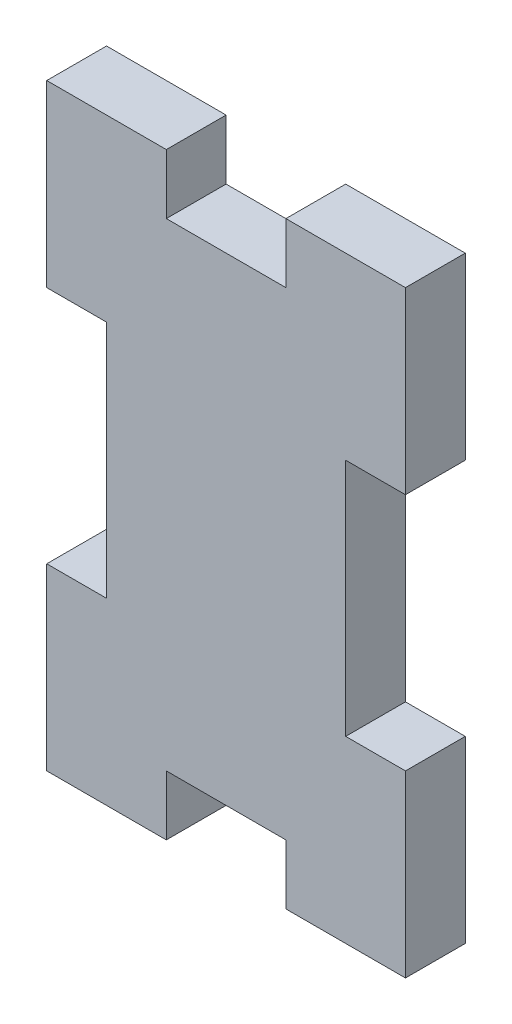
ISO-10303-21;
HEADER;
FILE_DESCRIPTION(('STEP AP214'),'2;1');
FILE_NAME('part.step','',(''),(''),'','','');
FILE_SCHEMA(('AUTOMOTIVE_DESIGN { 1 0 10303 214 1 1 1 1 }'));
ENDSEC;
DATA;
#1=APPLICATION_CONTEXT('core data for automotive mechanical design processes');
#2=APPLICATION_PROTOCOL_DEFINITION('international standard','automotive_design',2000,#1);
#3=PRODUCT_CONTEXT('',#1,'mechanical');
#4=PRODUCT('Part','Part','',(#3));
#5=PRODUCT_RELATED_PRODUCT_CATEGORY('part','',(#4));
#6=PRODUCT_DEFINITION_FORMATION('','',#4);
#7=PRODUCT_DEFINITION_CONTEXT('part definition',#1,'design');
#8=PRODUCT_DEFINITION('design','',#6,#7);
#9=PRODUCT_DEFINITION_SHAPE('','',#8);
#10=(LENGTH_UNIT() NAMED_UNIT(*) SI_UNIT(.MILLI.,.METRE.));
#11=(NAMED_UNIT(*) PLANE_ANGLE_UNIT() SI_UNIT($,.RADIAN.));
#12=(NAMED_UNIT(*) SI_UNIT($,.STERADIAN.) SOLID_ANGLE_UNIT());
#13=UNCERTAINTY_MEASURE_WITH_UNIT(LENGTH_MEASURE(1.E-05),#10,'distance_accuracy_value','');
#14=(GEOMETRIC_REPRESENTATION_CONTEXT(3) GLOBAL_UNCERTAINTY_ASSIGNED_CONTEXT((#13)) GLOBAL_UNIT_ASSIGNED_CONTEXT((#10,
#11,#12)) REPRESENTATION_CONTEXT('',''));
#15=CARTESIAN_POINT('',(0.,0.,0.));
#16=DIRECTION('',(0.,0.,1.));
#17=DIRECTION('',(1.,0.,0.));
#18=AXIS2_PLACEMENT_3D('',#15,#16,#17);
#19=CARTESIAN_POINT('',(12.9990004631941,15.5152745975511,5.));
#20=DIRECTION('',(1.,0.,0.));
#21=DIRECTION('',(0.,0.,-1.));
#22=AXIS2_PLACEMENT_3D('',#19,#20,#21);
#23=PLANE('',#22);
#24=DIRECTION('',(0.,-1.,0.));
#25=VECTOR('',#24,1.);
#26=CARTESIAN_POINT('',(12.9990004631941,15.5152745975511,0.));
#27=LINE('',#26,#25);
#28=CARTESIAN_POINT('',(12.9990004631941,20.5152745975511,0.));
#29=VERTEX_POINT('',#28);
#30=CARTESIAN_POINT('',(12.9990004631941,5.51527459755107,0.));
#31=VERTEX_POINT('',#30);
#32=EDGE_CURVE('E129',#29,#31,#27,.T.);
#33=ORIENTED_EDGE('',*,*,#32,.T.);
#34=DIRECTION('',(0.,0.,-1.));
#35=VECTOR('',#34,1.);
#36=CARTESIAN_POINT('',(12.9990004631941,5.51527459755107,5.));
#37=LINE('',#36,#35);
#38=CARTESIAN_POINT('',(12.9990004631941,5.51527459755107,5.));
#39=VERTEX_POINT('',#38);
#40=EDGE_CURVE('E11',#39,#31,#37,.T.);
#41=ORIENTED_EDGE('',*,*,#40,.F.);
#42=DIRECTION('',(0.,-1.,0.));
#43=VECTOR('',#42,1.);
#44=CARTESIAN_POINT('',(12.9990004631941,20.5152745975511,5.));
#45=LINE('',#44,#43);
#46=CARTESIAN_POINT('',(12.9990004631941,20.5152745975511,5.));
#47=VERTEX_POINT('',#46);
#48=EDGE_CURVE('E135',#47,#39,#45,.T.);
#49=ORIENTED_EDGE('',*,*,#48,.F.);
#50=DIRECTION('',(0.,0.,-1.));
#51=VECTOR('',#50,1.);
#52=CARTESIAN_POINT('',(12.9990004631941,20.5152745975511,5.));
#53=LINE('',#52,#51);
#54=EDGE_CURVE('E205',#47,#29,#53,.T.);
#55=ORIENTED_EDGE('',*,*,#54,.T.);
#56=EDGE_LOOP('',(#33,#41,#49,#55));
#57=FACE_BOUND('',#56,.T.);
#58=ADVANCED_FACE('F41',(#57),#23,.F.);
#59=CARTESIAN_POINT('',(12.9990004631941,5.51527459755107,5.));
#60=DIRECTION('',(0.,1.,0.));
#61=DIRECTION('',(0.,0.,1.));
#62=AXIS2_PLACEMENT_3D('',#59,#60,#61);
#63=PLANE('',#62);
#64=DIRECTION('',(1.,0.,0.));
#65=VECTOR('',#64,1.);
#66=CARTESIAN_POINT('',(12.9990004631941,5.51527459755107,0.));
#67=LINE('',#66,#65);
#68=CARTESIAN_POINT('',(17.9990004631941,5.51527459755107,0.));
#69=VERTEX_POINT('',#68);
#70=EDGE_CURVE('E210',#31,#69,#67,.T.);
#71=ORIENTED_EDGE('',*,*,#70,.T.);
#72=DIRECTION('',(0.,0.,-1.));
#73=VECTOR('',#72,1.);
#74=CARTESIAN_POINT('',(17.9990004631941,5.51527459755107,5.));
#75=LINE('',#74,#73);
#76=CARTESIAN_POINT('',(17.9990004631941,5.51527459755107,5.));
#77=VERTEX_POINT('',#76);
#78=EDGE_CURVE('E49',#77,#69,#75,.T.);
#79=ORIENTED_EDGE('',*,*,#78,.F.);
#80=DIRECTION('',(1.,0.,0.));
#81=VECTOR('',#80,1.);
#82=CARTESIAN_POINT('',(12.9990004631941,5.51527459755107,5.));
#83=LINE('',#82,#81);
#84=EDGE_CURVE('E356',#39,#77,#83,.T.);
#85=ORIENTED_EDGE('',*,*,#84,.F.);
#86=ORIENTED_EDGE('',*,*,#40,.T.);
#87=EDGE_LOOP('',(#71,#79,#85,#86));
#88=FACE_BOUND('',#87,.T.);
#89=ADVANCED_FACE('F359',(#88),#63,.F.);
#90=CARTESIAN_POINT('',(17.9990004631941,-14.4847254024489,5.));
#91=DIRECTION('',(1.,0.,0.));
#92=DIRECTION('',(0.,0.,-1.));
#93=AXIS2_PLACEMENT_3D('',#90,#91,#92);
#94=PLANE('',#93);
#95=DIRECTION('',(0.,-1.,0.));
#96=VECTOR('',#95,1.);
#97=CARTESIAN_POINT('',(17.9990004631941,-14.4847254024489,0.));
#98=LINE('',#97,#96);
#99=CARTESIAN_POINT('',(17.9990004631941,-14.4847254024489,0.));
#100=VERTEX_POINT('',#99);
#101=EDGE_CURVE('E212',#69,#100,#98,.T.);
#102=ORIENTED_EDGE('',*,*,#101,.T.);
#103=DIRECTION('',(0.,0.,-1.));
#104=VECTOR('',#103,1.);
#105=CARTESIAN_POINT('',(17.9990004631941,-14.4847254024489,5.));
#106=LINE('',#105,#104);
#107=CARTESIAN_POINT('',(17.9990004631941,-14.4847254024489,5.));
#108=VERTEX_POINT('',#107);
#109=EDGE_CURVE('E292',#108,#100,#106,.T.);
#110=ORIENTED_EDGE('',*,*,#109,.F.);
#111=DIRECTION('',(0.,-1.,0.));
#112=VECTOR('',#111,1.);
#113=CARTESIAN_POINT('',(17.9990004631941,-14.4847254024489,5.));
#114=LINE('',#113,#112);
#115=EDGE_CURVE('E301',#77,#108,#114,.T.);
#116=ORIENTED_EDGE('',*,*,#115,.F.);
#117=ORIENTED_EDGE('',*,*,#78,.T.);
#118=EDGE_LOOP('',(#102,#110,#116,#117));
#119=FACE_BOUND('',#118,.T.);
#120=ADVANCED_FACE('F299',(#119),#94,.F.);
#121=CARTESIAN_POINT('',(17.9990004631941,-14.4847254024489,5.));
#122=DIRECTION('',(0.,-1.,0.));
#123=DIRECTION('',(0.,0.,-1.));
#124=AXIS2_PLACEMENT_3D('',#121,#122,#123);
#125=PLANE('',#124);
#126=DIRECTION('',(-1.,0.,0.));
#127=VECTOR('',#126,1.);
#128=CARTESIAN_POINT('',(17.9990004631941,-14.4847254024489,0.));
#129=LINE('',#128,#127);
#130=CARTESIAN_POINT('',(12.9990004631941,-14.4847254024489,0.));
#131=VERTEX_POINT('',#130);
#132=EDGE_CURVE('E214',#100,#131,#129,.T.);
#133=ORIENTED_EDGE('',*,*,#132,.T.);
#134=DIRECTION('',(0.,0.,-1.));
#135=VECTOR('',#134,1.);
#136=CARTESIAN_POINT('',(12.9990004631941,-14.4847254024489,5.));
#137=LINE('',#136,#135);
#138=CARTESIAN_POINT('',(12.9990004631941,-14.4847254024489,5.));
#139=VERTEX_POINT('',#138);
#140=EDGE_CURVE('E289',#139,#131,#137,.T.);
#141=ORIENTED_EDGE('',*,*,#140,.F.);
#142=DIRECTION('',(-1.,0.,0.));
#143=VECTOR('',#142,1.);
#144=CARTESIAN_POINT('',(17.9990004631941,-14.4847254024489,5.));
#145=LINE('',#144,#143);
#146=EDGE_CURVE('E318',#108,#139,#145,.T.);
#147=ORIENTED_EDGE('',*,*,#146,.F.);
#148=ORIENTED_EDGE('',*,*,#109,.T.);
#149=EDGE_LOOP('',(#133,#141,#147,#148));
#150=FACE_BOUND('',#149,.T.);
#151=ADVANCED_FACE('F309',(#150),#125,.F.);
#152=CARTESIAN_POINT('',(12.9990004631941,-24.4847254024489,5.));
#153=DIRECTION('',(1.,0.,0.));
#154=DIRECTION('',(0.,0.,-1.));
#155=AXIS2_PLACEMENT_3D('',#152,#153,#154);
#156=PLANE('',#155);
#157=DIRECTION('',(0.,-1.,0.));
#158=VECTOR('',#157,1.);
#159=CARTESIAN_POINT('',(12.9990004631941,-24.4847254024489,0.));
#160=LINE('',#159,#158);
#161=CARTESIAN_POINT('',(12.9990004631941,-29.4847254024489,0.));
#162=VERTEX_POINT('',#161);
#163=EDGE_CURVE('E217',#131,#162,#160,.T.);
#164=ORIENTED_EDGE('',*,*,#163,.T.);
#165=DIRECTION('',(0.,0.,-1.));
#166=VECTOR('',#165,1.);
#167=CARTESIAN_POINT('',(12.9990004631941,-29.4847254024489,5.));
#168=LINE('',#167,#166);
#169=CARTESIAN_POINT('',(12.9990004631941,-29.4847254024489,5.));
#170=VERTEX_POINT('',#169);
#171=EDGE_CURVE('E286',#170,#162,#168,.T.);
#172=ORIENTED_EDGE('',*,*,#171,.F.);
#173=DIRECTION('',(0.,-1.,0.));
#174=VECTOR('',#173,1.);
#175=CARTESIAN_POINT('',(12.9990004631941,-14.4847254024489,5.));
#176=LINE('',#175,#174);
#177=EDGE_CURVE('E315',#139,#170,#176,.T.);
#178=ORIENTED_EDGE('',*,*,#177,.F.);
#179=ORIENTED_EDGE('',*,*,#140,.T.);
#180=EDGE_LOOP('',(#164,#172,#178,#179));
#181=FACE_BOUND('',#180,.T.);
#182=ADVANCED_FACE('F313',(#181),#156,.F.);
#183=CARTESIAN_POINT('',(12.9990004631941,-29.4847254024489,5.));
#184=DIRECTION('',(0.,1.,0.));
#185=DIRECTION('',(0.,0.,1.));
#186=AXIS2_PLACEMENT_3D('',#183,#184,#185);
#187=PLANE('',#186);
#188=DIRECTION('',(1.,0.,0.));
#189=VECTOR('',#188,1.);
#190=CARTESIAN_POINT('',(12.9990004631941,-29.4847254024489,0.));
#191=LINE('',#190,#189);
#192=CARTESIAN_POINT('',(22.9990004631945,-29.4847254024489,0.));
#193=VERTEX_POINT('',#192);
#194=EDGE_CURVE('E219',#162,#193,#191,.T.);
#195=ORIENTED_EDGE('',*,*,#194,.T.);
#196=DIRECTION('',(0.,0.,-1.));
#197=VECTOR('',#196,1.);
#198=CARTESIAN_POINT('',(22.9990004631945,-29.4847254024489,5.));
#199=LINE('',#198,#197);
#200=CARTESIAN_POINT('',(22.9990004631945,-29.4847254024489,5.));
#201=VERTEX_POINT('',#200);
#202=EDGE_CURVE('E283',#201,#193,#199,.T.);
#203=ORIENTED_EDGE('',*,*,#202,.F.);
#204=DIRECTION('',(1.,0.,0.));
#205=VECTOR('',#204,1.);
#206=CARTESIAN_POINT('',(12.9990004631941,-29.4847254024489,5.));
#207=LINE('',#206,#205);
#208=EDGE_CURVE('E317',#170,#201,#207,.T.);
#209=ORIENTED_EDGE('',*,*,#208,.F.);
#210=ORIENTED_EDGE('',*,*,#171,.T.);
#211=EDGE_LOOP('',(#195,#203,#209,#210));
#212=FACE_BOUND('',#211,.T.);
#213=ADVANCED_FACE('F371',(#212),#187,.F.);
#214=CARTESIAN_POINT('',(22.9990004631945,-29.4847254024489,5.));
#215=DIRECTION('',(-1.,0.,0.));
#216=DIRECTION('',(0.,0.,1.));
#217=AXIS2_PLACEMENT_3D('',#214,#215,#216);
#218=PLANE('',#217);
#219=DIRECTION('',(0.,1.,0.));
#220=VECTOR('',#219,1.);
#221=CARTESIAN_POINT('',(22.9990004631945,-29.4847254024489,0.));
#222=LINE('',#221,#220);
#223=CARTESIAN_POINT('',(22.9990004631945,-24.4847254024489,0.));
#224=VERTEX_POINT('',#223);
#225=EDGE_CURVE('E221',#193,#224,#222,.T.);
#226=ORIENTED_EDGE('',*,*,#225,.T.);
#227=DIRECTION('',(0.,0.,-1.));
#228=VECTOR('',#227,1.);
#229=CARTESIAN_POINT('',(22.9990004631945,-24.4847254024489,5.));
#230=LINE('',#229,#228);
#231=CARTESIAN_POINT('',(22.9990004631945,-24.4847254024489,5.));
#232=VERTEX_POINT('',#231);
#233=EDGE_CURVE('E280',#232,#224,#230,.T.);
#234=ORIENTED_EDGE('',*,*,#233,.F.);
#235=DIRECTION('',(0.,1.,0.));
#236=VECTOR('',#235,1.);
#237=CARTESIAN_POINT('',(22.9990004631945,-29.4847254024489,5.));
#238=LINE('',#237,#236);
#239=EDGE_CURVE('E320',#201,#232,#238,.T.);
#240=ORIENTED_EDGE('',*,*,#239,.F.);
#241=ORIENTED_EDGE('',*,*,#202,.T.);
#242=EDGE_LOOP('',(#226,#234,#240,#241));
#243=FACE_BOUND('',#242,.T.);
#244=ADVANCED_FACE('F374',(#243),#218,.F.);
#245=CARTESIAN_POINT('',(32.9990004631945,-24.4847254024489,5.));
#246=DIRECTION('',(0.,1.,0.));
#247=DIRECTION('',(0.,0.,1.));
#248=AXIS2_PLACEMENT_3D('',#245,#246,#247);
#249=PLANE('',#248);
#250=DIRECTION('',(1.,0.,0.));
#251=VECTOR('',#250,1.);
#252=CARTESIAN_POINT('',(32.9990004631945,-24.4847254024489,0.));
#253=LINE('',#252,#251);
#254=CARTESIAN_POINT('',(32.9990004631945,-24.4847254024489,0.));
#255=VERTEX_POINT('',#254);
#256=EDGE_CURVE('E223',#224,#255,#253,.T.);
#257=ORIENTED_EDGE('',*,*,#256,.T.);
#258=DIRECTION('',(0.,0.,-1.));
#259=VECTOR('',#258,1.);
#260=CARTESIAN_POINT('',(32.9990004631945,-24.4847254024489,5.));
#261=LINE('',#260,#259);
#262=CARTESIAN_POINT('',(32.9990004631945,-24.4847254024489,5.));
#263=VERTEX_POINT('',#262);
#264=EDGE_CURVE('E277',#263,#255,#261,.T.);
#265=ORIENTED_EDGE('',*,*,#264,.F.);
#266=DIRECTION('',(1.,0.,0.));
#267=VECTOR('',#266,1.);
#268=CARTESIAN_POINT('',(32.9990004631945,-24.4847254024489,5.));
#269=LINE('',#268,#267);
#270=EDGE_CURVE('E326',#232,#263,#269,.T.);
#271=ORIENTED_EDGE('',*,*,#270,.F.);
#272=ORIENTED_EDGE('',*,*,#233,.T.);
#273=EDGE_LOOP('',(#257,#265,#271,#272));
#274=FACE_BOUND('',#273,.T.);
#275=ADVANCED_FACE('F378',(#274),#249,.F.);
#276=CARTESIAN_POINT('',(32.9990004631945,-24.4847254024489,5.));
#277=DIRECTION('',(1.,0.,0.));
#278=DIRECTION('',(0.,0.,-1.));
#279=AXIS2_PLACEMENT_3D('',#276,#277,#278);
#280=PLANE('',#279);
#281=DIRECTION('',(0.,-1.,0.));
#282=VECTOR('',#281,1.);
#283=CARTESIAN_POINT('',(32.9990004631945,-24.4847254024489,0.));
#284=LINE('',#283,#282);
#285=CARTESIAN_POINT('',(32.9990004631945,-29.4847254024489,0.));
#286=VERTEX_POINT('',#285);
#287=EDGE_CURVE('E225',#255,#286,#284,.T.);
#288=ORIENTED_EDGE('',*,*,#287,.T.);
#289=DIRECTION('',(0.,0.,-1.));
#290=VECTOR('',#289,1.);
#291=CARTESIAN_POINT('',(32.9990004631945,-29.4847254024489,5.));
#292=LINE('',#291,#290);
#293=CARTESIAN_POINT('',(32.9990004631945,-29.4847254024489,5.));
#294=VERTEX_POINT('',#293);
#295=EDGE_CURVE('E274',#294,#286,#292,.T.);
#296=ORIENTED_EDGE('',*,*,#295,.F.);
#297=DIRECTION('',(0.,-1.,0.));
#298=VECTOR('',#297,1.);
#299=CARTESIAN_POINT('',(32.9990004631945,-24.4847254024489,5.));
#300=LINE('',#299,#298);
#301=EDGE_CURVE('E328',#263,#294,#300,.T.);
#302=ORIENTED_EDGE('',*,*,#301,.F.);
#303=ORIENTED_EDGE('',*,*,#264,.T.);
#304=EDGE_LOOP('',(#288,#296,#302,#303));
#305=FACE_BOUND('',#304,.T.);
#306=ADVANCED_FACE('F382',(#305),#280,.F.);
#307=CARTESIAN_POINT('',(32.9990004631945,-29.4847254024489,5.));
#308=DIRECTION('',(0.,1.,0.));
#309=DIRECTION('',(0.,0.,1.));
#310=AXIS2_PLACEMENT_3D('',#307,#308,#309);
#311=PLANE('',#310);
#312=DIRECTION('',(1.,0.,0.));
#313=VECTOR('',#312,1.);
#314=CARTESIAN_POINT('',(32.9990004631945,-29.4847254024489,0.));
#315=LINE('',#314,#313);
#316=CARTESIAN_POINT('',(42.9990004631941,-29.4847254024489,0.));
#317=VERTEX_POINT('',#316);
#318=EDGE_CURVE('E227',#286,#317,#315,.T.);
#319=ORIENTED_EDGE('',*,*,#318,.T.);
#320=DIRECTION('',(0.,0.,-1.));
#321=VECTOR('',#320,1.);
#322=CARTESIAN_POINT('',(42.9990004631941,-29.4847254024489,5.));
#323=LINE('',#322,#321);
#324=CARTESIAN_POINT('',(42.9990004631941,-29.4847254024489,5.));
#325=VERTEX_POINT('',#324);
#326=EDGE_CURVE('E271',#325,#317,#323,.T.);
#327=ORIENTED_EDGE('',*,*,#326,.F.);
#328=DIRECTION('',(1.,0.,0.));
#329=VECTOR('',#328,1.);
#330=CARTESIAN_POINT('',(32.9990004631945,-29.4847254024489,5.));
#331=LINE('',#330,#329);
#332=EDGE_CURVE('E330',#294,#325,#331,.T.);
#333=ORIENTED_EDGE('',*,*,#332,.F.);
#334=ORIENTED_EDGE('',*,*,#295,.T.);
#335=EDGE_LOOP('',(#319,#327,#333,#334));
#336=FACE_BOUND('',#335,.T.);
#337=ADVANCED_FACE('F386',(#336),#311,.F.);
#338=CARTESIAN_POINT('',(42.9990004631941,-24.4847254024489,5.));
#339=DIRECTION('',(-1.,0.,0.));
#340=DIRECTION('',(0.,0.,1.));
#341=AXIS2_PLACEMENT_3D('',#338,#339,#340);
#342=PLANE('',#341);
#343=DIRECTION('',(0.,1.,0.));
#344=VECTOR('',#343,1.);
#345=CARTESIAN_POINT('',(42.9990004631941,-24.4847254024489,0.));
#346=LINE('',#345,#344);
#347=CARTESIAN_POINT('',(42.9990004631941,-14.4847254024489,0.));
#348=VERTEX_POINT('',#347);
#349=EDGE_CURVE('E230',#317,#348,#346,.T.);
#350=ORIENTED_EDGE('',*,*,#349,.T.);
#351=DIRECTION('',(0.,0.,-1.));
#352=VECTOR('',#351,1.);
#353=CARTESIAN_POINT('',(42.9990004631941,-14.4847254024489,5.));
#354=LINE('',#353,#352);
#355=CARTESIAN_POINT('',(42.9990004631941,-14.4847254024489,5.));
#356=VERTEX_POINT('',#355);
#357=EDGE_CURVE('E268',#356,#348,#354,.T.);
#358=ORIENTED_EDGE('',*,*,#357,.F.);
#359=DIRECTION('',(0.,1.,0.));
#360=VECTOR('',#359,1.);
#361=CARTESIAN_POINT('',(42.9990004631941,-29.4847254024489,5.));
#362=LINE('',#361,#360);
#363=EDGE_CURVE('E332',#325,#356,#362,.T.);
#364=ORIENTED_EDGE('',*,*,#363,.F.);
#365=ORIENTED_EDGE('',*,*,#326,.T.);
#366=EDGE_LOOP('',(#350,#358,#364,#365));
#367=FACE_BOUND('',#366,.T.);
#368=ADVANCED_FACE('F390',(#367),#342,.F.);
#369=CARTESIAN_POINT('',(42.9990004631941,-14.4847254024489,5.));
#370=DIRECTION('',(0.,-1.,0.));
#371=DIRECTION('',(0.,0.,-1.));
#372=AXIS2_PLACEMENT_3D('',#369,#370,#371);
#373=PLANE('',#372);
#374=DIRECTION('',(-1.,0.,0.));
#375=VECTOR('',#374,1.);
#376=CARTESIAN_POINT('',(42.9990004631941,-14.4847254024489,0.));
#377=LINE('',#376,#375);
#378=CARTESIAN_POINT('',(37.9990004631941,-14.4847254024489,0.));
#379=VERTEX_POINT('',#378);
#380=EDGE_CURVE('E232',#348,#379,#377,.T.);
#381=ORIENTED_EDGE('',*,*,#380,.T.);
#382=DIRECTION('',(0.,0.,-1.));
#383=VECTOR('',#382,1.);
#384=CARTESIAN_POINT('',(37.9990004631941,-14.4847254024489,5.));
#385=LINE('',#384,#383);
#386=CARTESIAN_POINT('',(37.9990004631941,-14.4847254024489,5.));
#387=VERTEX_POINT('',#386);
#388=EDGE_CURVE('E265',#387,#379,#385,.T.);
#389=ORIENTED_EDGE('',*,*,#388,.F.);
#390=DIRECTION('',(-1.,0.,0.));
#391=VECTOR('',#390,1.);
#392=CARTESIAN_POINT('',(42.9990004631941,-14.4847254024489,5.));
#393=LINE('',#392,#391);
#394=EDGE_CURVE('E334',#356,#387,#393,.T.);
#395=ORIENTED_EDGE('',*,*,#394,.F.);
#396=ORIENTED_EDGE('',*,*,#357,.T.);
#397=EDGE_LOOP('',(#381,#389,#395,#396));
#398=FACE_BOUND('',#397,.T.);
#399=ADVANCED_FACE('F394',(#398),#373,.F.);
#400=CARTESIAN_POINT('',(37.9990004631941,5.51527459755107,5.));
#401=DIRECTION('',(-1.,0.,0.));
#402=DIRECTION('',(0.,0.,1.));
#403=AXIS2_PLACEMENT_3D('',#400,#401,#402);
#404=PLANE('',#403);
#405=DIRECTION('',(0.,1.,0.));
#406=VECTOR('',#405,1.);
#407=CARTESIAN_POINT('',(37.9990004631941,5.51527459755107,0.));
#408=LINE('',#407,#406);
#409=CARTESIAN_POINT('',(37.9990004631941,5.51527459755107,0.));
#410=VERTEX_POINT('',#409);
#411=EDGE_CURVE('E234',#379,#410,#408,.T.);
#412=ORIENTED_EDGE('',*,*,#411,.T.);
#413=DIRECTION('',(0.,0.,-1.));
#414=VECTOR('',#413,1.);
#415=CARTESIAN_POINT('',(37.9990004631941,5.51527459755107,5.));
#416=LINE('',#415,#414);
#417=CARTESIAN_POINT('',(37.9990004631941,5.51527459755107,5.));
#418=VERTEX_POINT('',#417);
#419=EDGE_CURVE('E262',#418,#410,#416,.T.);
#420=ORIENTED_EDGE('',*,*,#419,.F.);
#421=DIRECTION('',(0.,1.,0.));
#422=VECTOR('',#421,1.);
#423=CARTESIAN_POINT('',(37.9990004631941,5.51527459755107,5.));
#424=LINE('',#423,#422);
#425=EDGE_CURVE('E336',#387,#418,#424,.T.);
#426=ORIENTED_EDGE('',*,*,#425,.F.);
#427=ORIENTED_EDGE('',*,*,#388,.T.);
#428=EDGE_LOOP('',(#412,#420,#426,#427));
#429=FACE_BOUND('',#428,.T.);
#430=ADVANCED_FACE('F398',(#429),#404,.F.);
#431=CARTESIAN_POINT('',(37.9990004631941,5.51527459755107,5.));
#432=DIRECTION('',(0.,1.,0.));
#433=DIRECTION('',(0.,0.,1.));
#434=AXIS2_PLACEMENT_3D('',#431,#432,#433);
#435=PLANE('',#434);
#436=DIRECTION('',(1.,0.,0.));
#437=VECTOR('',#436,1.);
#438=CARTESIAN_POINT('',(37.9990004631941,5.51527459755107,0.));
#439=LINE('',#438,#437);
#440=CARTESIAN_POINT('',(42.9990004631941,5.51527459755107,0.));
#441=VERTEX_POINT('',#440);
#442=EDGE_CURVE('E236',#410,#441,#439,.T.);
#443=ORIENTED_EDGE('',*,*,#442,.T.);
#444=DIRECTION('',(0.,0.,-1.));
#445=VECTOR('',#444,1.);
#446=CARTESIAN_POINT('',(42.9990004631941,5.51527459755107,5.));
#447=LINE('',#446,#445);
#448=CARTESIAN_POINT('',(42.9990004631941,5.51527459755107,5.));
#449=VERTEX_POINT('',#448);
#450=EDGE_CURVE('E259',#449,#441,#447,.T.);
#451=ORIENTED_EDGE('',*,*,#450,.F.);
#452=DIRECTION('',(1.,0.,0.));
#453=VECTOR('',#452,1.);
#454=CARTESIAN_POINT('',(37.9990004631941,5.51527459755107,5.));
#455=LINE('',#454,#453);
#456=EDGE_CURVE('E338',#418,#449,#455,.T.);
#457=ORIENTED_EDGE('',*,*,#456,.F.);
#458=ORIENTED_EDGE('',*,*,#419,.T.);
#459=EDGE_LOOP('',(#443,#451,#457,#458));
#460=FACE_BOUND('',#459,.T.);
#461=ADVANCED_FACE('F402',(#460),#435,.F.);
#462=CARTESIAN_POINT('',(42.9990004631941,15.5152745975511,5.));
#463=DIRECTION('',(-1.,0.,0.));
#464=DIRECTION('',(0.,0.,1.));
#465=AXIS2_PLACEMENT_3D('',#462,#463,#464);
#466=PLANE('',#465);
#467=DIRECTION('',(0.,1.,0.));
#468=VECTOR('',#467,1.);
#469=CARTESIAN_POINT('',(42.9990004631941,15.5152745975511,0.));
#470=LINE('',#469,#468);
#471=CARTESIAN_POINT('',(42.9990004631941,20.5152745975511,0.));
#472=VERTEX_POINT('',#471);
#473=EDGE_CURVE('E239',#441,#472,#470,.T.);
#474=ORIENTED_EDGE('',*,*,#473,.T.);
#475=DIRECTION('',(0.,0.,-1.));
#476=VECTOR('',#475,1.);
#477=CARTESIAN_POINT('',(42.9990004631941,20.5152745975511,5.));
#478=LINE('',#477,#476);
#479=CARTESIAN_POINT('',(42.9990004631941,20.5152745975511,5.));
#480=VERTEX_POINT('',#479);
#481=EDGE_CURVE('E256',#480,#472,#478,.T.);
#482=ORIENTED_EDGE('',*,*,#481,.F.);
#483=DIRECTION('',(0.,1.,0.));
#484=VECTOR('',#483,1.);
#485=CARTESIAN_POINT('',(42.9990004631941,5.51527459755107,5.));
#486=LINE('',#485,#484);
#487=EDGE_CURVE('E340',#449,#480,#486,.T.);
#488=ORIENTED_EDGE('',*,*,#487,.F.);
#489=ORIENTED_EDGE('',*,*,#450,.T.);
#490=EDGE_LOOP('',(#474,#482,#488,#489));
#491=FACE_BOUND('',#490,.T.);
#492=ADVANCED_FACE('F406',(#491),#466,.F.);
#493=CARTESIAN_POINT('',(42.9990004631941,20.5152745975511,5.));
#494=DIRECTION('',(0.,-1.,0.));
#495=DIRECTION('',(0.,0.,-1.));
#496=AXIS2_PLACEMENT_3D('',#493,#494,#495);
#497=PLANE('',#496);
#498=DIRECTION('',(-1.,0.,0.));
#499=VECTOR('',#498,1.);
#500=CARTESIAN_POINT('',(42.9990004631941,20.5152745975511,0.));
#501=LINE('',#500,#499);
#502=CARTESIAN_POINT('',(32.9990004631945,20.5152745975511,0.));
#503=VERTEX_POINT('',#502);
#504=EDGE_CURVE('E241',#472,#503,#501,.T.);
#505=ORIENTED_EDGE('',*,*,#504,.T.);
#506=DIRECTION('',(0.,0.,-1.));
#507=VECTOR('',#506,1.);
#508=CARTESIAN_POINT('',(32.9990004631945,20.5152745975511,5.));
#509=LINE('',#508,#507);
#510=CARTESIAN_POINT('',(32.9990004631945,20.5152745975511,5.));
#511=VERTEX_POINT('',#510);
#512=EDGE_CURVE('E253',#511,#503,#509,.T.);
#513=ORIENTED_EDGE('',*,*,#512,.F.);
#514=DIRECTION('',(-1.,0.,0.));
#515=VECTOR('',#514,1.);
#516=CARTESIAN_POINT('',(42.9990004631941,20.5152745975511,5.));
#517=LINE('',#516,#515);
#518=EDGE_CURVE('E342',#480,#511,#517,.T.);
#519=ORIENTED_EDGE('',*,*,#518,.F.);
#520=ORIENTED_EDGE('',*,*,#481,.T.);
#521=EDGE_LOOP('',(#505,#513,#519,#520));
#522=FACE_BOUND('',#521,.T.);
#523=ADVANCED_FACE('F348',(#522),#497,.F.);
#524=CARTESIAN_POINT('',(32.9990004631945,20.5152745975511,5.));
#525=DIRECTION('',(1.,0.,0.));
#526=DIRECTION('',(0.,0.,-1.));
#527=AXIS2_PLACEMENT_3D('',#524,#525,#526);
#528=PLANE('',#527);
#529=DIRECTION('',(0.,-1.,0.));
#530=VECTOR('',#529,1.);
#531=CARTESIAN_POINT('',(32.9990004631945,20.5152745975511,0.));
#532=LINE('',#531,#530);
#533=CARTESIAN_POINT('',(32.9990004631945,15.5152745975511,0.));
#534=VERTEX_POINT('',#533);
#535=EDGE_CURVE('E243',#503,#534,#532,.T.);
#536=ORIENTED_EDGE('',*,*,#535,.T.);
#537=DIRECTION('',(0.,0.,-1.));
#538=VECTOR('',#537,1.);
#539=CARTESIAN_POINT('',(32.9990004631945,15.5152745975511,5.));
#540=LINE('',#539,#538);
#541=CARTESIAN_POINT('',(32.9990004631945,15.5152745975511,5.));
#542=VERTEX_POINT('',#541);
#543=EDGE_CURVE('E200',#542,#534,#540,.T.);
#544=ORIENTED_EDGE('',*,*,#543,.F.);
#545=DIRECTION('',(0.,-1.,0.));
#546=VECTOR('',#545,1.);
#547=CARTESIAN_POINT('',(32.9990004631945,20.5152745975511,5.));
#548=LINE('',#547,#546);
#549=EDGE_CURVE('E191',#511,#542,#548,.T.);
#550=ORIENTED_EDGE('',*,*,#549,.F.);
#551=ORIENTED_EDGE('',*,*,#512,.T.);
#552=EDGE_LOOP('',(#536,#544,#550,#551));
#553=FACE_BOUND('',#552,.T.);
#554=ADVANCED_FACE('F352',(#553),#528,.F.);
#555=CARTESIAN_POINT('',(22.9990004631945,15.5152745975511,5.));
#556=DIRECTION('',(0.,-1.,0.));
#557=DIRECTION('',(0.,0.,-1.));
#558=AXIS2_PLACEMENT_3D('',#555,#556,#557);
#559=PLANE('',#558);
#560=DIRECTION('',(-1.,0.,0.));
#561=VECTOR('',#560,1.);
#562=CARTESIAN_POINT('',(22.9990004631945,15.5152745975511,0.));
#563=LINE('',#562,#561);
#564=CARTESIAN_POINT('',(22.9990004631945,15.5152745975511,0.));
#565=VERTEX_POINT('',#564);
#566=EDGE_CURVE('E199',#534,#565,#563,.T.);
#567=ORIENTED_EDGE('',*,*,#566,.T.);
#568=DIRECTION('',(0.,0.,-1.));
#569=VECTOR('',#568,1.);
#570=CARTESIAN_POINT('',(22.9990004631945,15.5152745975511,5.));
#571=LINE('',#570,#569);
#572=CARTESIAN_POINT('',(22.9990004631945,15.5152745975511,5.));
#573=VERTEX_POINT('',#572);
#574=EDGE_CURVE('E196',#573,#565,#571,.T.);
#575=ORIENTED_EDGE('',*,*,#574,.F.);
#576=DIRECTION('',(-1.,0.,0.));
#577=VECTOR('',#576,1.);
#578=CARTESIAN_POINT('',(22.9990004631945,15.5152745975511,5.));
#579=LINE('',#578,#577);
#580=EDGE_CURVE('E185',#542,#573,#579,.T.);
#581=ORIENTED_EDGE('',*,*,#580,.F.);
#582=ORIENTED_EDGE('',*,*,#543,.T.);
#583=EDGE_LOOP('',(#567,#575,#581,#582));
#584=FACE_BOUND('',#583,.T.);
#585=ADVANCED_FACE('F197',(#584),#559,.F.);
#586=CARTESIAN_POINT('',(22.9990004631945,15.5152745975511,5.));
#587=DIRECTION('',(-1.,0.,0.));
#588=DIRECTION('',(0.,0.,1.));
#589=AXIS2_PLACEMENT_3D('',#586,#587,#588);
#590=PLANE('',#589);
#591=DIRECTION('',(0.,1.,0.));
#592=VECTOR('',#591,1.);
#593=CARTESIAN_POINT('',(22.9990004631945,15.5152745975511,0.));
#594=LINE('',#593,#592);
#595=CARTESIAN_POINT('',(22.9990004631945,20.5152745975511,0.));
#596=VERTEX_POINT('',#595);
#597=EDGE_CURVE('E122',#565,#596,#594,.T.);
#598=ORIENTED_EDGE('',*,*,#597,.T.);
#599=DIRECTION('',(0.,0.,-1.));
#600=VECTOR('',#599,1.);
#601=CARTESIAN_POINT('',(22.9990004631945,20.5152745975511,5.));
#602=LINE('',#601,#600);
#603=CARTESIAN_POINT('',(22.9990004631945,20.5152745975511,5.));
#604=VERTEX_POINT('',#603);
#605=EDGE_CURVE('E201',#604,#596,#602,.T.);
#606=ORIENTED_EDGE('',*,*,#605,.F.);
#607=DIRECTION('',(0.,1.,0.));
#608=VECTOR('',#607,1.);
#609=CARTESIAN_POINT('',(22.9990004631945,15.5152745975511,5.));
#610=LINE('',#609,#608);
#611=EDGE_CURVE('E189',#573,#604,#610,.T.);
#612=ORIENTED_EDGE('',*,*,#611,.F.);
#613=ORIENTED_EDGE('',*,*,#574,.T.);
#614=EDGE_LOOP('',(#598,#606,#612,#613));
#615=FACE_BOUND('',#614,.T.);
#616=ADVANCED_FACE('F203',(#615),#590,.F.);
#617=CARTESIAN_POINT('',(22.9990004631945,20.5152745975511,5.));
#618=DIRECTION('',(0.,-1.,0.));
#619=DIRECTION('',(0.,0.,-1.));
#620=AXIS2_PLACEMENT_3D('',#617,#618,#619);
#621=PLANE('',#620);
#622=DIRECTION('',(-1.,0.,0.));
#623=VECTOR('',#622,1.);
#624=CARTESIAN_POINT('',(22.9990004631945,20.5152745975511,0.));
#625=LINE('',#624,#623);
#626=EDGE_CURVE('E247',#596,#29,#625,.T.);
#627=ORIENTED_EDGE('',*,*,#626,.T.);
#628=ORIENTED_EDGE('',*,*,#54,.F.);
#629=DIRECTION('',(-1.,0.,0.));
#630=VECTOR('',#629,1.);
#631=CARTESIAN_POINT('',(22.9990004631945,20.5152745975511,5.));
#632=LINE('',#631,#630);
#633=EDGE_CURVE('E57',#604,#47,#632,.T.);
#634=ORIENTED_EDGE('',*,*,#633,.F.);
#635=ORIENTED_EDGE('',*,*,#605,.T.);
#636=EDGE_LOOP('',(#627,#628,#634,#635));
#637=FACE_BOUND('',#636,.T.);
#638=ADVANCED_FACE('F354',(#637),#621,.F.);
#639=CARTESIAN_POINT('',(0.,0.,5.));
#640=DIRECTION('',(0.,0.,1.));
#641=DIRECTION('',(1.,0.,0.));
#642=AXIS2_PLACEMENT_3D('',#639,#640,#641);
#643=PLANE('',#642);
#644=ORIENTED_EDGE('',*,*,#48,.T.);
#645=ORIENTED_EDGE('',*,*,#84,.T.);
#646=ORIENTED_EDGE('',*,*,#115,.T.);
#647=ORIENTED_EDGE('',*,*,#146,.T.);
#648=ORIENTED_EDGE('',*,*,#177,.T.);
#649=ORIENTED_EDGE('',*,*,#208,.T.);
#650=ORIENTED_EDGE('',*,*,#239,.T.);
#651=ORIENTED_EDGE('',*,*,#270,.T.);
#652=ORIENTED_EDGE('',*,*,#301,.T.);
#653=ORIENTED_EDGE('',*,*,#332,.T.);
#654=ORIENTED_EDGE('',*,*,#363,.T.);
#655=ORIENTED_EDGE('',*,*,#394,.T.);
#656=ORIENTED_EDGE('',*,*,#425,.T.);
#657=ORIENTED_EDGE('',*,*,#456,.T.);
#658=ORIENTED_EDGE('',*,*,#487,.T.);
#659=ORIENTED_EDGE('',*,*,#518,.T.);
#660=ORIENTED_EDGE('',*,*,#549,.T.);
#661=ORIENTED_EDGE('',*,*,#580,.T.);
#662=ORIENTED_EDGE('',*,*,#611,.T.);
#663=ORIENTED_EDGE('',*,*,#633,.T.);
#664=EDGE_LOOP('',(#644,#645,#646,#647,#648,#649,#650,#651,#652,#653,#654,#655,#656,#657,#658,
#659,#660,#661,#662,#663));
#665=FACE_BOUND('',#664,.T.);
#666=ADVANCED_FACE('F187',(#665),#643,.T.);
#667=CARTESIAN_POINT('',(0.,0.,0.));
#668=DIRECTION('',(0.,0.,1.));
#669=DIRECTION('',(1.,0.,0.));
#670=AXIS2_PLACEMENT_3D('',#667,#668,#669);
#671=PLANE('',#670);
#672=ORIENTED_EDGE('',*,*,#32,.F.);
#673=ORIENTED_EDGE('',*,*,#626,.F.);
#674=ORIENTED_EDGE('',*,*,#597,.F.);
#675=ORIENTED_EDGE('',*,*,#566,.F.);
#676=ORIENTED_EDGE('',*,*,#535,.F.);
#677=ORIENTED_EDGE('',*,*,#504,.F.);
#678=ORIENTED_EDGE('',*,*,#473,.F.);
#679=ORIENTED_EDGE('',*,*,#442,.F.);
#680=ORIENTED_EDGE('',*,*,#411,.F.);
#681=ORIENTED_EDGE('',*,*,#380,.F.);
#682=ORIENTED_EDGE('',*,*,#349,.F.);
#683=ORIENTED_EDGE('',*,*,#318,.F.);
#684=ORIENTED_EDGE('',*,*,#287,.F.);
#685=ORIENTED_EDGE('',*,*,#256,.F.);
#686=ORIENTED_EDGE('',*,*,#225,.F.);
#687=ORIENTED_EDGE('',*,*,#194,.F.);
#688=ORIENTED_EDGE('',*,*,#163,.F.);
#689=ORIENTED_EDGE('',*,*,#132,.F.);
#690=ORIENTED_EDGE('',*,*,#101,.F.);
#691=ORIENTED_EDGE('',*,*,#70,.F.);
#692=EDGE_LOOP('',(#672,#673,#674,#675,#676,#677,#678,#679,#680,#681,#682,#683,#684,#685,#686,
#687,#688,#689,#690,#691));
#693=FACE_BOUND('',#692,.T.);
#694=ADVANCED_FACE('F305',(#693),#671,.F.);
#695=CLOSED_SHELL('',(#58,#89,#120,#151,#182,#213,#244,#275,#306,#337,#368,#399,#430,#461,#492,
#523,#554,#585,#616,#638,#666,#694));
#696=MANIFOLD_SOLID_BREP('B2',#695);
#697=ADVANCED_BREP_SHAPE_REPRESENTATION('',(#18,#696),#14);
#698=SHAPE_DEFINITION_REPRESENTATION(#9,#697);
ENDSEC;
END-ISO-10303-21;
